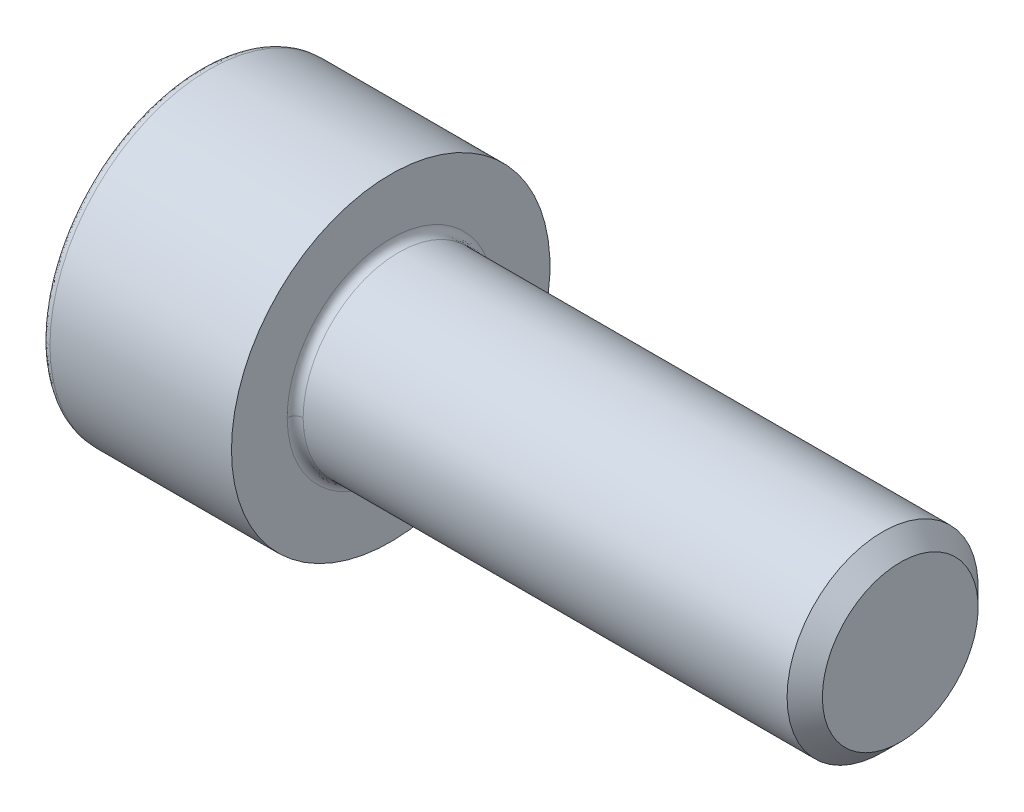
ISO-10303-21;
HEADER;
FILE_DESCRIPTION(('STEP AP214'),'2;1');
FILE_NAME('part.step','',(''),(''),'','','');
FILE_SCHEMA(('AUTOMOTIVE_DESIGN { 1 0 10303 214 1 1 1 1 }'));
ENDSEC;
DATA;
#1=APPLICATION_CONTEXT('core data for automotive mechanical design processes');
#2=APPLICATION_PROTOCOL_DEFINITION('international standard','automotive_design',2000,#1);
#3=PRODUCT_CONTEXT('',#1,'mechanical');
#4=PRODUCT('Part','Part','',(#3));
#5=PRODUCT_RELATED_PRODUCT_CATEGORY('part','',(#4));
#6=PRODUCT_DEFINITION_FORMATION('','',#4);
#7=PRODUCT_DEFINITION_CONTEXT('part definition',#1,'design');
#8=PRODUCT_DEFINITION('design','',#6,#7);
#9=PRODUCT_DEFINITION_SHAPE('','',#8);
#10=(LENGTH_UNIT() NAMED_UNIT(*) SI_UNIT(.MILLI.,.METRE.));
#11=(NAMED_UNIT(*) PLANE_ANGLE_UNIT() SI_UNIT($,.RADIAN.));
#12=(NAMED_UNIT(*) SI_UNIT($,.STERADIAN.) SOLID_ANGLE_UNIT());
#13=UNCERTAINTY_MEASURE_WITH_UNIT(LENGTH_MEASURE(1.E-05),#10,'distance_accuracy_value','');
#14=(GEOMETRIC_REPRESENTATION_CONTEXT(3) GLOBAL_UNCERTAINTY_ASSIGNED_CONTEXT((#13)) GLOBAL_UNIT_ASSIGNED_CONTEXT((#10,
#11,#12)) REPRESENTATION_CONTEXT('',''));
#15=CARTESIAN_POINT('',(0.,0.,0.));
#16=DIRECTION('',(0.,0.,1.));
#17=DIRECTION('',(1.,0.,0.));
#18=AXIS2_PLACEMENT_3D('',#15,#16,#17);
#19=CARTESIAN_POINT('',(22.,-2.474846,2.474846));
#20=DIRECTION('',(1.,0.,0.));
#21=DIRECTION('',(0.,0.,-1.));
#22=AXIS2_PLACEMENT_3D('',#19,#20,#21);
#23=PLANE('',#22);
#24=CARTESIAN_POINT('',(22.,0.,0.));
#25=DIRECTION('',(-1.,0.,0.));
#26=DIRECTION('',(0.,0.,1.));
#27=AXIS2_PLACEMENT_3D('',#24,#25,#26);
#28=CIRCLE('',#27,2.44549999999998);
#29=CARTESIAN_POINT('',(22.,0.,2.44549999999998));
#30=VERTEX_POINT('',#29);
#31=EDGE_CURVE('E21',#30,#30,#28,.F.);
#32=ORIENTED_EDGE('',*,*,#31,.T.);
#33=EDGE_LOOP('',(#32));
#34=FACE_BOUND('',#33,.T.);
#35=ADVANCED_FACE('F17',(#34),#23,.T.);
#36=CARTESIAN_POINT('',(22.,0.,0.));
#37=DIRECTION('',(-1.,0.,0.));
#38=DIRECTION('',(0.,0.,1.));
#39=AXIS2_PLACEMENT_3D('',#36,#37,#38);
#40=CONICAL_SURFACE('',#39,2.4455,0.785398163397446);
#41=CARTESIAN_POINT('',(21.4455,0.,0.));
#42=DIRECTION('',(-1.,0.,0.));
#43=DIRECTION('',(0.,0.,1.));
#44=AXIS2_PLACEMENT_3D('',#41,#42,#43);
#45=CIRCLE('',#44,3.);
#46=CARTESIAN_POINT('',(21.4455,0.,3.));
#47=VERTEX_POINT('',#46);
#48=EDGE_CURVE('E351',#47,#47,#45,.F.);
#49=ORIENTED_EDGE('',*,*,#48,.T.);
#50=EDGE_LOOP('',(#49));
#51=FACE_BOUND('',#50,.T.);
#52=ORIENTED_EDGE('',*,*,#31,.F.);
#53=EDGE_LOOP('',(#52));
#54=FACE_BOUND('',#53,.T.);
#55=ADVANCED_FACE('F440',(#51,#54),#40,.T.);
#56=CARTESIAN_POINT('',(21.4455,0.,0.));
#57=DIRECTION('',(-1.,0.,0.));
#58=DIRECTION('',(0.,0.,1.));
#59=AXIS2_PLACEMENT_3D('',#56,#57,#58);
#60=CYLINDRICAL_SURFACE('',#59,3.);
#61=CARTESIAN_POINT('',(6.24999999978248,0.,0.));
#62=DIRECTION('',(1.,0.,0.));
#63=DIRECTION('',(0.,0.,-1.));
#64=AXIS2_PLACEMENT_3D('',#61,#62,#63);
#65=CIRCLE('',#64,3.00000000023549);
#66=CARTESIAN_POINT('',(6.24999999978248,-3.07655142772997E-10,-3.00000000017662));
#67=VERTEX_POINT('',#66);
#68=CARTESIAN_POINT('',(6.24999999983686,0.,3.00000000017662));
#69=VERTEX_POINT('',#68);
#70=EDGE_CURVE('E354',#67,#69,#65,.T.);
#71=ORIENTED_EDGE('',*,*,#70,.T.);
#72=CARTESIAN_POINT('',(6.24999999978248,0.,0.));
#73=DIRECTION('',(1.,0.,0.));
#74=DIRECTION('',(0.,0.,-1.));
#75=AXIS2_PLACEMENT_3D('',#72,#73,#74);
#76=CIRCLE('',#75,3.00000000023549);
#77=EDGE_CURVE('E343',#69,#67,#76,.T.);
#78=ORIENTED_EDGE('',*,*,#77,.T.);
#79=EDGE_LOOP('',(#71,#78));
#80=FACE_BOUND('',#79,.T.);
#81=ORIENTED_EDGE('',*,*,#48,.F.);
#82=EDGE_LOOP('',(#81));
#83=FACE_BOUND('',#82,.T.);
#84=ADVANCED_FACE('F328',(#80,#83),#60,.T.);
#85=CARTESIAN_POINT('',(6.001248959,0.,3.274958354));
#86=CARTESIAN_POINT('',(6.001248959,-6.549916708,3.274958354));
#87=CARTESIAN_POINT('',(6.001248959,-6.549916708,-3.274958354));
#88=CARTESIAN_POINT('',(6.001248959,0.,-3.274958354));
#89=CARTESIAN_POINT('',(5.984194894,0.,3.104986559));
#90=CARTESIAN_POINT('',(5.984194894,-6.209973117,3.104986559));
#91=CARTESIAN_POINT('',(5.984194894,-6.209973117,-3.104986559));
#92=CARTESIAN_POINT('',(5.984194894,0.,-3.104986559));
#93=CARTESIAN_POINT('',(6.104986559,0.,2.984194894));
#94=CARTESIAN_POINT('',(6.104986559,-5.968389789,2.984194894));
#95=CARTESIAN_POINT('',(6.104986559,-5.968389789,-2.984194894));
#96=CARTESIAN_POINT('',(6.104986559,0.,-2.984194894));
#97=CARTESIAN_POINT('',(6.274958354,0.,3.001248959));
#98=CARTESIAN_POINT('',(6.274958354,-6.002497917,3.001248959));
#99=CARTESIAN_POINT('',(6.274958354,-6.002497917,-3.001248959));
#100=CARTESIAN_POINT('',(6.274958354,0.,-3.001248959));
#101=(BOUNDED_SURFACE() B_SPLINE_SURFACE(3,3,((#85,#86,#87,#88),(#89,#90,#91,#92),(#93,#94,#95,
#96),(#97,#98,#99,#100)),.UNSPECIFIED.,.F.,.F.,.F.) B_SPLINE_SURFACE_WITH_KNOTS((4,4),(4,4),(0.,
1.),(0.,1.),.UNSPECIFIED.) GEOMETRIC_REPRESENTATION_ITEM() RATIONAL_B_SPLINE_SURFACE(((1.,
0.333333333333333,0.333333333333333,1.),(0.755320871117972,0.251773623705991,0.251773623705991,
0.755320871117972),(0.755320871117972,0.251773623705991,0.251773623705991,0.755320871117972),
(1.,0.333333333333333,0.333333333333333,1.))) REPRESENTATION_ITEM('') SURFACE());
#102=CARTESIAN_POINT('',(6.001248959,0.,3.274958354));
#103=CARTESIAN_POINT('',(5.984194894,0.,3.104986559));
#104=CARTESIAN_POINT('',(6.104986559,0.,2.984194894));
#105=CARTESIAN_POINT('',(6.274958354,0.,3.001248959));
#106=(BOUNDED_CURVE() B_SPLINE_CURVE(3,(#102,#103,#104,#105),.UNSPECIFIED.,.F.,
.F.) B_SPLINE_CURVE_WITH_KNOTS((4,4),(0.,1.),
.UNSPECIFIED.) CURVE() GEOMETRIC_REPRESENTATION_ITEM() RATIONAL_B_SPLINE_CURVE((1.,
0.755320871117972,0.755320871117972,1.)) REPRESENTATION_ITEM(''));
#107=CARTESIAN_POINT('',(6.00000000014129,0.,3.24999999964183));
#108=VERTEX_POINT('',#107);
#109=EDGE_CURVE('E303',#69,#108,#106,.F.);
#110=CARTESIAN_POINT('',(6.00000000023549,0.,3.24999999981333));
#111=CARTESIAN_POINT('',(6.00000000023549,-6.49999999950396,3.24999999981333));
#112=CARTESIAN_POINT('',(6.00000000023549,-6.49999999950396,-3.24999999981333));
#113=CARTESIAN_POINT('',(6.00000000023549,0.,-3.24999999981333));
#114=(BOUNDED_CURVE() B_SPLINE_CURVE(3,(#110,#111,#112,#113),.UNSPECIFIED.,.F.,
.F.) B_SPLINE_CURVE_WITH_KNOTS((4,4),(0.,1.),
.UNSPECIFIED.) CURVE() GEOMETRIC_REPRESENTATION_ITEM() RATIONAL_B_SPLINE_CURVE((0.95657830221489,
0.31885943407163,0.31885943407163,0.95657830221489)) REPRESENTATION_ITEM(''));
#115=CARTESIAN_POINT('',(6.00000000014129,0.,-3.24999999964183));
#116=VERTEX_POINT('',#115);
#117=EDGE_CURVE('E363',#116,#108,#114,.F.);
#118=CARTESIAN_POINT('',(6.001248959,0.,-3.274958354));
#119=CARTESIAN_POINT('',(5.984194894,0.,-3.104986559));
#120=CARTESIAN_POINT('',(6.104986559,0.,-2.984194894));
#121=CARTESIAN_POINT('',(6.274958354,0.,-3.001248959));
#122=(BOUNDED_CURVE() B_SPLINE_CURVE(3,(#118,#119,#120,#121),.UNSPECIFIED.,.F.,
.F.) B_SPLINE_CURVE_WITH_KNOTS((4,4),(0.,1.),
.UNSPECIFIED.) CURVE() GEOMETRIC_REPRESENTATION_ITEM() RATIONAL_B_SPLINE_CURVE((1.,
0.755320871117972,0.755320871117972,1.)) REPRESENTATION_ITEM(''));
#123=EDGE_CURVE('E350',#116,#67,#122,.T.);
#124=ORIENTED_EDGE('',*,*,#109,.T.);
#125=ORIENTED_EDGE('',*,*,#117,.F.);
#126=ORIENTED_EDGE('',*,*,#123,.T.);
#127=ORIENTED_EDGE('',*,*,#77,.F.);
#128=EDGE_LOOP('',(#124,#125,#126,#127));
#129=FACE_BOUND('',#128,.T.);
#130=ADVANCED_FACE('F317',(#129),#101,.F.);
#131=CARTESIAN_POINT('',(6.001248959,0.,-3.274958354));
#132=CARTESIAN_POINT('',(6.001248959,6.549916708,-3.274958354));
#133=CARTESIAN_POINT('',(6.001248959,6.549916708,3.274958354));
#134=CARTESIAN_POINT('',(6.001248959,0.,3.274958354));
#135=CARTESIAN_POINT('',(5.984194894,0.,-3.104986559));
#136=CARTESIAN_POINT('',(5.984194894,6.209973117,-3.104986559));
#137=CARTESIAN_POINT('',(5.984194894,6.209973117,3.104986559));
#138=CARTESIAN_POINT('',(5.984194894,0.,3.104986559));
#139=CARTESIAN_POINT('',(6.104986559,0.,-2.984194894));
#140=CARTESIAN_POINT('',(6.104986559,5.968389789,-2.984194894));
#141=CARTESIAN_POINT('',(6.104986559,5.968389789,2.984194894));
#142=CARTESIAN_POINT('',(6.104986559,0.,2.984194894));
#143=CARTESIAN_POINT('',(6.274958354,0.,-3.001248959));
#144=CARTESIAN_POINT('',(6.274958354,6.002497917,-3.001248959));
#145=CARTESIAN_POINT('',(6.274958354,6.002497917,3.001248959));
#146=CARTESIAN_POINT('',(6.274958354,0.,3.001248959));
#147=(BOUNDED_SURFACE() B_SPLINE_SURFACE(3,3,((#131,#132,#133,#134),(#135,#136,#137,#138),(#139,
#140,#141,#142),(#143,#144,#145,#146)),.UNSPECIFIED.,.F.,.F.,
.F.) B_SPLINE_SURFACE_WITH_KNOTS((4,4),(4,4),(0.,1.),(0.,1.),
.UNSPECIFIED.) GEOMETRIC_REPRESENTATION_ITEM() RATIONAL_B_SPLINE_SURFACE(((1.,0.333333333333333,
0.333333333333333,1.),(0.755320871117972,0.251773623705991,0.251773623705991,0.755320871117972),
(0.755320871117972,0.251773623705991,0.251773623705991,0.755320871117972),(1.,0.333333333333333,
0.333333333333333,1.))) REPRESENTATION_ITEM('') SURFACE());
#148=CARTESIAN_POINT('',(6.00000000023549,0.,-3.24999999981333));
#149=CARTESIAN_POINT('',(6.00000000023549,6.49999999950396,-3.24999999981333));
#150=CARTESIAN_POINT('',(6.00000000023549,6.49999999950396,3.24999999981333));
#151=CARTESIAN_POINT('',(6.00000000023549,0.,3.24999999981333));
#152=(BOUNDED_CURVE() B_SPLINE_CURVE(3,(#148,#149,#150,#151),.UNSPECIFIED.,.F.,
.F.) B_SPLINE_CURVE_WITH_KNOTS((4,4),(0.,1.),
.UNSPECIFIED.) CURVE() GEOMETRIC_REPRESENTATION_ITEM() RATIONAL_B_SPLINE_CURVE((0.956578302214891,
0.31885943407163,0.31885943407163,0.956578302214891)) REPRESENTATION_ITEM(''));
#153=EDGE_CURVE('E299',#108,#116,#152,.F.);
#154=ORIENTED_EDGE('',*,*,#70,.F.);
#155=ORIENTED_EDGE('',*,*,#123,.F.);
#156=ORIENTED_EDGE('',*,*,#153,.F.);
#157=ORIENTED_EDGE('',*,*,#109,.F.);
#158=EDGE_LOOP('',(#154,#155,#156,#157));
#159=FACE_BOUND('',#158,.T.);
#160=ADVANCED_FACE('F305',(#159),#147,.F.);
#161=CARTESIAN_POINT('',(6.,-5.06,5.06));
#162=DIRECTION('',(1.,0.,0.));
#163=DIRECTION('',(0.,0.,-1.));
#164=AXIS2_PLACEMENT_3D('',#161,#162,#163);
#165=PLANE('',#164);
#166=ORIENTED_EDGE('',*,*,#117,.T.);
#167=ORIENTED_EDGE('',*,*,#153,.T.);
#168=EDGE_LOOP('',(#166,#167));
#169=FACE_BOUND('',#168,.T.);
#170=CARTESIAN_POINT('',(6.,0.,0.));
#171=DIRECTION('',(-1.,0.,0.));
#172=DIRECTION('',(0.,0.,1.));
#173=AXIS2_PLACEMENT_3D('',#170,#171,#172);
#174=CIRCLE('',#173,5.);
#175=CARTESIAN_POINT('',(6.,0.,5.));
#176=VERTEX_POINT('',#175);
#177=EDGE_CURVE('E287',#176,#176,#174,.F.);
#178=ORIENTED_EDGE('',*,*,#177,.T.);
#179=EDGE_LOOP('',(#178));
#180=FACE_BOUND('',#179,.T.);
#181=ADVANCED_FACE('F316',(#169,#180),#165,.T.);
#182=CARTESIAN_POINT('',(6.,0.,0.));
#183=DIRECTION('',(-1.,0.,0.));
#184=DIRECTION('',(0.,0.,1.));
#185=AXIS2_PLACEMENT_3D('',#182,#183,#184);
#186=CYLINDRICAL_SURFACE('',#185,5.);
#187=ORIENTED_EDGE('',*,*,#177,.F.);
#188=EDGE_LOOP('',(#187));
#189=FACE_BOUND('',#188,.T.);
#190=CARTESIAN_POINT('',(0.29999999980743,0.,0.));
#191=DIRECTION('',(-1.,0.,0.));
#192=DIRECTION('',(0.,-1.,0.));
#193=AXIS2_PLACEMENT_3D('',#190,#191,#192);
#194=CIRCLE('',#193,5.00000000038587);
#195=CARTESIAN_POINT('',(0.299999999855573,-2.24484071071833E-10,5.0000000002894));
#196=VERTEX_POINT('',#195);
#197=CARTESIAN_POINT('',(0.29999999980743,-5.12758571288328E-10,-5.0000000002894));
#198=VERTEX_POINT('',#197);
#199=EDGE_CURVE('E284',#196,#198,#194,.T.);
#200=ORIENTED_EDGE('',*,*,#199,.F.);
#201=CARTESIAN_POINT('',(0.29999999980743,0.,0.));
#202=DIRECTION('',(-1.,0.,0.));
#203=DIRECTION('',(0.,-1.,0.));
#204=AXIS2_PLACEMENT_3D('',#201,#202,#203);
#205=CIRCLE('',#204,5.00000000038587);
#206=EDGE_CURVE('E290',#198,#196,#205,.T.);
#207=ORIENTED_EDGE('',*,*,#206,.F.);
#208=EDGE_LOOP('',(#200,#207));
#209=FACE_BOUND('',#208,.T.);
#210=ADVANCED_FACE('F231',(#189,#209),#186,.T.);
#211=CARTESIAN_POINT('',(0.00149875,0.,4.670049975));
#212=CARTESIAN_POINT('',(0.00149875,9.34009995,4.670049975));
#213=CARTESIAN_POINT('',(0.00149875,9.34009995,-4.670049975));
#214=CARTESIAN_POINT('',(0.00149875,0.,-4.670049975));
#215=CARTESIAN_POINT('',(-0.018966127,0.,4.87401613));
#216=CARTESIAN_POINT('',(-0.018966127,9.748032259,4.87401613));
#217=CARTESIAN_POINT('',(-0.018966127,9.748032259,-4.87401613));
#218=CARTESIAN_POINT('',(-0.018966127,0.,-4.87401613));
#219=CARTESIAN_POINT('',(0.12598387,0.,5.018966127));
#220=CARTESIAN_POINT('',(0.12598387,10.037932254,5.018966127));
#221=CARTESIAN_POINT('',(0.12598387,10.037932254,-5.018966127));
#222=CARTESIAN_POINT('',(0.12598387,0.,-5.018966127));
#223=CARTESIAN_POINT('',(0.329950025,0.,4.99850125));
#224=CARTESIAN_POINT('',(0.329950025,9.997002499,4.99850125));
#225=CARTESIAN_POINT('',(0.329950025,9.997002499,-4.99850125));
#226=CARTESIAN_POINT('',(0.329950025,0.,-4.99850125));
#227=(BOUNDED_SURFACE() B_SPLINE_SURFACE(3,3,((#211,#212,#213,#214),(#215,#216,#217,#218),(#219,
#220,#221,#222),(#223,#224,#225,#226)),.UNSPECIFIED.,.F.,.F.,
.F.) B_SPLINE_SURFACE_WITH_KNOTS((4,4),(4,4),(0.,1.),(0.,1.),
.UNSPECIFIED.) GEOMETRIC_REPRESENTATION_ITEM() RATIONAL_B_SPLINE_SURFACE(((1.,0.333333333333333,
0.333333333333333,1.),(0.755320871117972,0.251773623705991,0.251773623705991,0.755320871117972),
(0.755320871117972,0.251773623705991,0.251773623705991,0.755320871117972),(1.,0.333333333333333,
0.333333333333333,1.))) REPRESENTATION_ITEM('') SURFACE());
#228=CARTESIAN_POINT('',(-3.85867261707578E-10,0.,-4.70000000022572));
#229=CARTESIAN_POINT('',(-3.85867264776779E-10,9.4000000003199,-4.70000000022572));
#230=CARTESIAN_POINT('',(-3.85867264776779E-10,9.4000000003199,4.70000000022572));
#231=CARTESIAN_POINT('',(-3.85867261707578E-10,0.,4.70000000022572));
#232=(BOUNDED_CURVE() B_SPLINE_CURVE(3,(#228,#229,#230,#231),.UNSPECIFIED.,.F.,
.F.) B_SPLINE_CURVE_WITH_KNOTS((4,4),(0.,1.),
.UNSPECIFIED.) CURVE() GEOMETRIC_REPRESENTATION_ITEM() RATIONAL_B_SPLINE_CURVE((0.95657830212221,
0.318859434040737,0.318859434040737,0.95657830212221)) REPRESENTATION_ITEM(''));
#233=CARTESIAN_POINT('',(-2.3152035707117E-10,0.,4.69999999919632));
#234=VERTEX_POINT('',#233);
#235=CARTESIAN_POINT('',(-2.3152035707117E-10,0.,-4.69999999919632));
#236=VERTEX_POINT('',#235);
#237=EDGE_CURVE('E86',#234,#236,#232,.F.);
#238=CARTESIAN_POINT('',(0.00149875,0.,4.670049975));
#239=CARTESIAN_POINT('',(-0.018966127,0.,4.87401613));
#240=CARTESIAN_POINT('',(0.12598387,0.,5.018966127));
#241=CARTESIAN_POINT('',(0.329950025,0.,4.99850125));
#242=(BOUNDED_CURVE() B_SPLINE_CURVE(3,(#238,#239,#240,#241),.UNSPECIFIED.,.F.,
.F.) B_SPLINE_CURVE_WITH_KNOTS((4,4),(0.,1.),
.UNSPECIFIED.) CURVE() GEOMETRIC_REPRESENTATION_ITEM() RATIONAL_B_SPLINE_CURVE((1.,
0.755320871117972,0.755320871117972,1.)) REPRESENTATION_ITEM(''));
#243=EDGE_CURVE('E204',#196,#234,#242,.F.);
#244=CARTESIAN_POINT('',(0.00149875,0.,-4.670049975));
#245=CARTESIAN_POINT('',(-0.018966127,0.,-4.87401613));
#246=CARTESIAN_POINT('',(0.12598387,0.,-5.018966127));
#247=CARTESIAN_POINT('',(0.329950025,0.,-4.99850125));
#248=(BOUNDED_CURVE() B_SPLINE_CURVE(3,(#244,#245,#246,#247),.UNSPECIFIED.,.F.,
.F.) B_SPLINE_CURVE_WITH_KNOTS((4,4),(0.,1.),
.UNSPECIFIED.) CURVE() GEOMETRIC_REPRESENTATION_ITEM() RATIONAL_B_SPLINE_CURVE((1.,
0.755320871117972,0.755320871117972,1.)) REPRESENTATION_ITEM(''));
#249=EDGE_CURVE('E286',#236,#198,#248,.T.);
#250=ORIENTED_EDGE('',*,*,#237,.F.);
#251=ORIENTED_EDGE('',*,*,#243,.F.);
#252=ORIENTED_EDGE('',*,*,#199,.T.);
#253=ORIENTED_EDGE('',*,*,#249,.F.);
#254=EDGE_LOOP('',(#250,#251,#252,#253));
#255=FACE_BOUND('',#254,.T.);
#256=ADVANCED_FACE('F219',(#255),#227,.T.);
#257=CARTESIAN_POINT('',(0.00149875,0.,-4.670049975));
#258=CARTESIAN_POINT('',(0.00149875,-9.34009995,-4.670049975));
#259=CARTESIAN_POINT('',(0.00149875,-9.34009995,4.670049975));
#260=CARTESIAN_POINT('',(0.00149875,0.,4.670049975));
#261=CARTESIAN_POINT('',(-0.018966127,0.,-4.87401613));
#262=CARTESIAN_POINT('',(-0.018966127,-9.748032259,-4.87401613));
#263=CARTESIAN_POINT('',(-0.018966127,-9.748032259,4.87401613));
#264=CARTESIAN_POINT('',(-0.018966127,0.,4.87401613));
#265=CARTESIAN_POINT('',(0.12598387,0.,-5.018966127));
#266=CARTESIAN_POINT('',(0.12598387,-10.037932254,-5.018966127));
#267=CARTESIAN_POINT('',(0.12598387,-10.037932254,5.018966127));
#268=CARTESIAN_POINT('',(0.12598387,0.,5.018966127));
#269=CARTESIAN_POINT('',(0.329950025,0.,-4.99850125));
#270=CARTESIAN_POINT('',(0.329950025,-9.997002499,-4.99850125));
#271=CARTESIAN_POINT('',(0.329950025,-9.997002499,4.99850125));
#272=CARTESIAN_POINT('',(0.329950025,0.,4.99850125));
#273=(BOUNDED_SURFACE() B_SPLINE_SURFACE(3,3,((#257,#258,#259,#260),(#261,#262,#263,#264),(#265,
#266,#267,#268),(#269,#270,#271,#272)),.UNSPECIFIED.,.F.,.F.,
.F.) B_SPLINE_SURFACE_WITH_KNOTS((4,4),(4,4),(0.,1.),(0.,1.),
.UNSPECIFIED.) GEOMETRIC_REPRESENTATION_ITEM() RATIONAL_B_SPLINE_SURFACE(((1.,0.333333333333333,
0.333333333333333,1.),(0.755320871117972,0.251773623705991,0.251773623705991,0.755320871117972),
(0.755320871117972,0.251773623705991,0.251773623705991,0.755320871117972),(1.,0.333333333333333,
0.333333333333333,1.))) REPRESENTATION_ITEM('') SURFACE());
#274=CARTESIAN_POINT('',(-3.85867261925231E-10,0.,4.70000000022572));
#275=CARTESIAN_POINT('',(-3.85867264679281E-10,-9.4000000003199,4.70000000022572));
#276=CARTESIAN_POINT('',(-3.85867264679281E-10,-9.4000000003199,-4.70000000022572));
#277=CARTESIAN_POINT('',(-3.85867261925231E-10,0.,-4.70000000022572));
#278=(BOUNDED_CURVE() B_SPLINE_CURVE(3,(#274,#275,#276,#277),.UNSPECIFIED.,.F.,
.F.) B_SPLINE_CURVE_WITH_KNOTS((4,4),(0.,1.),
.UNSPECIFIED.) CURVE() GEOMETRIC_REPRESENTATION_ITEM() RATIONAL_B_SPLINE_CURVE((0.95657830212221,
0.318859434040737,0.318859434040737,0.95657830212221)) REPRESENTATION_ITEM(''));
#279=EDGE_CURVE('E199',#236,#234,#278,.F.);
#280=ORIENTED_EDGE('',*,*,#243,.T.);
#281=ORIENTED_EDGE('',*,*,#279,.F.);
#282=ORIENTED_EDGE('',*,*,#249,.T.);
#283=ORIENTED_EDGE('',*,*,#206,.T.);
#284=EDGE_LOOP('',(#280,#281,#282,#283));
#285=FACE_BOUND('',#284,.T.);
#286=ADVANCED_FACE('F206',(#285),#273,.T.);
#287=CARTESIAN_POINT('',(0.,1.467624384,2.542));
#288=DIRECTION('',(0.,-0.866025403678227,-0.500000000183963));
#289=DIRECTION('',(0.,0.500000000183963,-0.866025403678227));
#290=AXIS2_PLACEMENT_3D('',#287,#288,#289);
#291=PLANE('',#290);
#292=DIRECTION('',(0.,-0.500000000183963,0.866025403678227));
#293=VECTOR('',#292,1.);
#294=CARTESIAN_POINT('',(3.,2.2014365765,1.271));
#295=LINE('',#294,#293);
#296=CARTESIAN_POINT('',(3.,2.20143657635501,1.27100000025113));
#297=VERTEX_POINT('',#296);
#298=CARTESIAN_POINT('',(3.,1.467624384,2.542));
#299=VERTEX_POINT('',#298);
#300=EDGE_CURVE('E265',#297,#299,#295,.T.);
#301=ORIENTED_EDGE('',*,*,#300,.T.);
#302=DIRECTION('',(-1.,0.,0.));
#303=VECTOR('',#302,1.);
#304=CARTESIAN_POINT('',(1.5,1.467624384,2.542));
#305=LINE('',#304,#303);
#306=CARTESIAN_POINT('',(0.,1.4676243852548,2.541999999613));
#307=VERTEX_POINT('',#306);
#308=EDGE_CURVE('E184',#299,#307,#305,.T.);
#309=ORIENTED_EDGE('',*,*,#308,.T.);
#310=DIRECTION('',(0.,-0.50000000064581,0.86602540341158));
#311=VECTOR('',#310,1.);
#312=CARTESIAN_POINT('',(0.,2.9352487730192,0.));
#313=LINE('',#312,#311);
#314=CARTESIAN_POINT('',(0.,2.9352487717632,-4.35091117865008E-10));
#315=VERTEX_POINT('',#314);
#316=EDGE_CURVE('E194',#315,#307,#313,.T.);
#317=ORIENTED_EDGE('',*,*,#316,.F.);
#318=DIRECTION('',(1.,0.,0.));
#319=VECTOR('',#318,1.);
#320=CARTESIAN_POINT('',(1.5,2.935248769,0.));
#321=LINE('',#320,#319);
#322=CARTESIAN_POINT('',(3.,2.935248769,0.));
#323=VERTEX_POINT('',#322);
#324=EDGE_CURVE('E77',#315,#323,#321,.T.);
#325=ORIENTED_EDGE('',*,*,#324,.T.);
#326=DIRECTION('',(0.,-0.500000000183963,0.866025403678227));
#327=VECTOR('',#326,1.);
#328=CARTESIAN_POINT('',(3.,2.2014365765,1.271));
#329=LINE('',#328,#327);
#330=EDGE_CURVE('E263',#323,#297,#329,.T.);
#331=ORIENTED_EDGE('',*,*,#330,.T.);
#332=EDGE_LOOP('',(#301,#309,#317,#325,#331));
#333=FACE_BOUND('',#332,.T.);
#334=ADVANCED_FACE('F218',(#333),#291,.T.);
#335=CARTESIAN_POINT('',(0.,1.467624384,2.542));
#336=DIRECTION('',(0.,0.,1.));
#337=DIRECTION('',(0.,-1.,0.));
#338=AXIS2_PLACEMENT_3D('',#335,#336,#337);
#339=PLANE('',#338);
#340=ORIENTED_EDGE('',*,*,#308,.F.);
#341=DIRECTION('',(0.,1.,0.));
#342=VECTOR('',#341,1.);
#343=CARTESIAN_POINT('',(3.,0.,2.542));
#344=LINE('',#343,#342);
#345=CARTESIAN_POINT('',(3.,-2.28255403465839E-10,2.542));
#346=VERTEX_POINT('',#345);
#347=EDGE_CURVE('E188',#346,#299,#344,.T.);
#348=ORIENTED_EDGE('',*,*,#347,.F.);
#349=DIRECTION('',(0.,1.,0.));
#350=VECTOR('',#349,1.);
#351=CARTESIAN_POINT('',(3.,0.,2.542));
#352=LINE('',#351,#350);
#353=CARTESIAN_POINT('',(3.,-1.467624384,2.542));
#354=VERTEX_POINT('',#353);
#355=EDGE_CURVE('E124',#354,#346,#352,.T.);
#356=ORIENTED_EDGE('',*,*,#355,.F.);
#357=DIRECTION('',(1.,0.,0.));
#358=VECTOR('',#357,1.);
#359=CARTESIAN_POINT('',(1.5,-1.467624384,2.542));
#360=LINE('',#359,#358);
#361=CARTESIAN_POINT('',(0.,-1.4676243852548,2.541999999613));
#362=VERTEX_POINT('',#361);
#363=EDGE_CURVE('E187',#362,#354,#360,.T.);
#364=ORIENTED_EDGE('',*,*,#363,.F.);
#365=DIRECTION('',(0.,-1.,0.));
#366=VECTOR('',#365,1.);
#367=CARTESIAN_POINT('',(0.,0.,2.541999999484));
#368=LINE('',#367,#366);
#369=EDGE_CURVE('E191',#307,#362,#368,.T.);
#370=ORIENTED_EDGE('',*,*,#369,.F.);
#371=EDGE_LOOP('',(#340,#348,#356,#364,#370));
#372=FACE_BOUND('',#371,.T.);
#373=ADVANCED_FACE('F468',(#372),#339,.F.);
#374=CARTESIAN_POINT('',(0.,-2.935248769,0.));
#375=DIRECTION('',(0.,0.866025403678227,-0.500000000183963));
#376=DIRECTION('',(0.,0.500000000183963,0.866025403678227));
#377=AXIS2_PLACEMENT_3D('',#374,#375,#376);
#378=PLANE('',#377);
#379=DIRECTION('',(0.,-0.500000000183963,-0.866025403678227));
#380=VECTOR('',#379,1.);
#381=CARTESIAN_POINT('',(3.,-2.2014365765,1.271));
#382=LINE('',#381,#380);
#383=CARTESIAN_POINT('',(3.,-2.20143657635501,1.27100000025113));
#384=VERTEX_POINT('',#383);
#385=CARTESIAN_POINT('',(3.,-2.935248769,0.));
#386=VERTEX_POINT('',#385);
#387=EDGE_CURVE('E181',#384,#386,#382,.T.);
#388=ORIENTED_EDGE('',*,*,#387,.T.);
#389=DIRECTION('',(1.,0.,0.));
#390=VECTOR('',#389,1.);
#391=CARTESIAN_POINT('',(1.5,-2.935248769,0.));
#392=LINE('',#391,#390);
#393=CARTESIAN_POINT('',(0.,-2.9352487717632,4.35090866656742E-10));
#394=VERTEX_POINT('',#393);
#395=EDGE_CURVE('E174',#394,#386,#392,.T.);
#396=ORIENTED_EDGE('',*,*,#395,.F.);
#397=DIRECTION('',(0.,-0.50000000064581,-0.86602540341158));
#398=VECTOR('',#397,1.);
#399=CARTESIAN_POINT('',(0.,-1.4676243865096,2.541999999484));
#400=LINE('',#399,#398);
#401=EDGE_CURVE('E193',#362,#394,#400,.T.);
#402=ORIENTED_EDGE('',*,*,#401,.F.);
#403=ORIENTED_EDGE('',*,*,#363,.T.);
#404=DIRECTION('',(0.,-0.500000000183963,-0.866025403678227));
#405=VECTOR('',#404,1.);
#406=CARTESIAN_POINT('',(3.,-2.2014365765,1.271));
#407=LINE('',#406,#405);
#408=EDGE_CURVE('E116',#354,#384,#407,.T.);
#409=ORIENTED_EDGE('',*,*,#408,.T.);
#410=EDGE_LOOP('',(#388,#396,#402,#403,#409));
#411=FACE_BOUND('',#410,.T.);
#412=ADVANCED_FACE('F464',(#411),#378,.T.);
#413=CARTESIAN_POINT('',(0.,1.467624384,-2.542));
#414=DIRECTION('',(0.,0.866025403678227,-0.500000000183963));
#415=DIRECTION('',(0.,0.500000000183963,0.866025403678227));
#416=AXIS2_PLACEMENT_3D('',#413,#414,#415);
#417=PLANE('',#416);
#418=DIRECTION('',(1.,0.,0.));
#419=VECTOR('',#418,1.);
#420=CARTESIAN_POINT('',(1.5,1.467624384,-2.542));
#421=LINE('',#420,#419);
#422=CARTESIAN_POINT('',(0.,1.46762438510584,-2.542));
#423=VERTEX_POINT('',#422);
#424=CARTESIAN_POINT('',(3.,1.46762438411084,-2.542));
#425=VERTEX_POINT('',#424);
#426=EDGE_CURVE('E155',#423,#425,#421,.T.);
#427=ORIENTED_EDGE('',*,*,#426,.T.);
#428=DIRECTION('',(0.,-0.500000000183963,-0.866025403678227));
#429=VECTOR('',#428,1.);
#430=CARTESIAN_POINT('',(3.,2.2014365765,-1.271));
#431=LINE('',#430,#429);
#432=CARTESIAN_POINT('',(3.,2.20143657656491,-1.27099999981833));
#433=VERTEX_POINT('',#432);
#434=EDGE_CURVE('E172',#433,#425,#431,.T.);
#435=ORIENTED_EDGE('',*,*,#434,.F.);
#436=DIRECTION('',(0.,-0.500000000183963,-0.866025403678227));
#437=VECTOR('',#436,1.);
#438=CARTESIAN_POINT('',(3.,2.2014365765,-1.271));
#439=LINE('',#438,#437);
#440=EDGE_CURVE('E175',#323,#433,#439,.T.);
#441=ORIENTED_EDGE('',*,*,#440,.F.);
#442=ORIENTED_EDGE('',*,*,#324,.F.);
#443=DIRECTION('',(0.,0.50000000064581,0.86602540341158));
#444=VECTOR('',#443,1.);
#445=CARTESIAN_POINT('',(0.,1.4676243865096,-2.541999999484));
#446=LINE('',#445,#444);
#447=EDGE_CURVE('E158',#423,#315,#446,.T.);
#448=ORIENTED_EDGE('',*,*,#447,.F.);
#449=EDGE_LOOP('',(#427,#435,#441,#442,#448));
#450=FACE_BOUND('',#449,.T.);
#451=ADVANCED_FACE('F478',(#450),#417,.F.);
#452=CARTESIAN_POINT('',(0.,-1.467624384,-2.542));
#453=DIRECTION('',(0.,0.866025403678227,0.500000000183963));
#454=DIRECTION('',(0.,-0.500000000183963,0.866025403678227));
#455=AXIS2_PLACEMENT_3D('',#452,#453,#454);
#456=PLANE('',#455);
#457=DIRECTION('',(0.,0.500000000183963,-0.866025403678227));
#458=VECTOR('',#457,1.);
#459=CARTESIAN_POINT('',(3.,-2.2014365765,-1.271));
#460=LINE('',#459,#458);
#461=CARTESIAN_POINT('',(3.,-2.20143657645078,-1.27100000001601));
#462=VERTEX_POINT('',#461);
#463=CARTESIAN_POINT('',(3.,-1.46762438401385,-2.541999999976));
#464=VERTEX_POINT('',#463);
#465=EDGE_CURVE('E136',#462,#464,#460,.T.);
#466=ORIENTED_EDGE('',*,*,#465,.T.);
#467=DIRECTION('',(-1.,0.,0.));
#468=VECTOR('',#467,1.);
#469=CARTESIAN_POINT('',(1.5,-1.467624384,-2.542));
#470=LINE('',#469,#468);
#471=CARTESIAN_POINT('',(0.,-1.46762438510584,-2.542));
#472=VERTEX_POINT('',#471);
#473=EDGE_CURVE('E139',#464,#472,#470,.T.);
#474=ORIENTED_EDGE('',*,*,#473,.T.);
#475=DIRECTION('',(0.,0.50000000064581,-0.86602540341158));
#476=VECTOR('',#475,1.);
#477=CARTESIAN_POINT('',(0.,-2.9352487730192,0.));
#478=LINE('',#477,#476);
#479=EDGE_CURVE('E429',#394,#472,#478,.T.);
#480=ORIENTED_EDGE('',*,*,#479,.F.);
#481=ORIENTED_EDGE('',*,*,#395,.T.);
#482=DIRECTION('',(0.,0.500000000183963,-0.866025403678227));
#483=VECTOR('',#482,1.);
#484=CARTESIAN_POINT('',(3.,-2.2014365765,-1.271));
#485=LINE('',#484,#483);
#486=EDGE_CURVE('E142',#386,#462,#485,.T.);
#487=ORIENTED_EDGE('',*,*,#486,.T.);
#488=EDGE_LOOP('',(#466,#474,#480,#481,#487));
#489=FACE_BOUND('',#488,.T.);
#490=ADVANCED_FACE('F137',(#489),#456,.T.);
#491=CARTESIAN_POINT('',(0.,-4.7564,-4.7564));
#492=DIRECTION('',(-1.,0.,0.));
#493=DIRECTION('',(0.,0.,1.));
#494=AXIS2_PLACEMENT_3D('',#491,#492,#493);
#495=PLANE('',#494);
#496=DIRECTION('',(0.,1.,0.));
#497=VECTOR('',#496,1.);
#498=CARTESIAN_POINT('',(0.,0.,-2.542));
#499=LINE('',#498,#497);
#500=EDGE_CURVE('E150',#472,#423,#499,.T.);
#501=ORIENTED_EDGE('',*,*,#500,.T.);
#502=ORIENTED_EDGE('',*,*,#447,.T.);
#503=ORIENTED_EDGE('',*,*,#316,.T.);
#504=ORIENTED_EDGE('',*,*,#369,.T.);
#505=ORIENTED_EDGE('',*,*,#401,.T.);
#506=ORIENTED_EDGE('',*,*,#479,.T.);
#507=EDGE_LOOP('',(#501,#502,#503,#504,#505,#506));
#508=FACE_BOUND('',#507,.T.);
#509=ORIENTED_EDGE('',*,*,#237,.T.);
#510=ORIENTED_EDGE('',*,*,#279,.T.);
#511=EDGE_LOOP('',(#509,#510));
#512=FACE_BOUND('',#511,.T.);
#513=ADVANCED_FACE('F394',(#508,#512),#495,.T.);
#514=CARTESIAN_POINT('',(0.,-1.467624384,-2.542));
#515=DIRECTION('',(0.,0.,-1.));
#516=DIRECTION('',(0.,1.,0.));
#517=AXIS2_PLACEMENT_3D('',#514,#515,#516);
#518=PLANE('',#517);
#519=ORIENTED_EDGE('',*,*,#473,.F.);
#520=DIRECTION('',(0.,-1.,0.));
#521=VECTOR('',#520,1.);
#522=CARTESIAN_POINT('',(3.,0.,-2.542));
#523=LINE('',#522,#521);
#524=CARTESIAN_POINT('',(3.,-5.21372915285972E-10,-2.542));
#525=VERTEX_POINT('',#524);
#526=EDGE_CURVE('E36',#525,#464,#523,.T.);
#527=ORIENTED_EDGE('',*,*,#526,.F.);
#528=DIRECTION('',(0.,-1.,0.));
#529=VECTOR('',#528,1.);
#530=CARTESIAN_POINT('',(3.,1.1007182885,-2.542));
#531=LINE('',#530,#529);
#532=EDGE_CURVE('E179',#425,#525,#531,.T.);
#533=ORIENTED_EDGE('',*,*,#532,.F.);
#534=ORIENTED_EDGE('',*,*,#426,.F.);
#535=ORIENTED_EDGE('',*,*,#500,.F.);
#536=EDGE_LOOP('',(#519,#527,#533,#534,#535));
#537=FACE_BOUND('',#536,.T.);
#538=ADVANCED_FACE('F148',(#537),#518,.F.);
#539=CARTESIAN_POINT('',(3.,-0.013208619,1.263374));
#540=DIRECTION('',(-1.,0.,0.));
#541=DIRECTION('',(0.,0.,1.));
#542=AXIS2_PLACEMENT_3D('',#539,#540,#541);
#543=PLANE('',#542);
#544=ORIENTED_EDGE('',*,*,#347,.T.);
#545=ORIENTED_EDGE('',*,*,#300,.F.);
#546=CARTESIAN_POINT('',(3.,0.,0.));
#547=DIRECTION('',(-1.,0.,0.));
#548=DIRECTION('',(0.,0.,1.));
#549=AXIS2_PLACEMENT_3D('',#546,#547,#548);
#550=CIRCLE('',#549,2.542);
#551=EDGE_CURVE('E425',#346,#297,#550,.T.);
#552=ORIENTED_EDGE('',*,*,#551,.F.);
#553=EDGE_LOOP('',(#544,#545,#552));
#554=FACE_BOUND('',#553,.T.);
#555=ADVANCED_FACE('F473',(#554),#543,.T.);
#556=CARTESIAN_POINT('',(3.,2.197033703,-1.286252));
#557=DIRECTION('',(-1.,0.,0.));
#558=DIRECTION('',(0.,0.,1.));
#559=AXIS2_PLACEMENT_3D('',#556,#557,#558);
#560=PLANE('',#559);
#561=ORIENTED_EDGE('',*,*,#330,.F.);
#562=ORIENTED_EDGE('',*,*,#440,.T.);
#563=CARTESIAN_POINT('',(3.,0.,0.));
#564=DIRECTION('',(-1.,0.,0.));
#565=DIRECTION('',(0.,0.,1.));
#566=AXIS2_PLACEMENT_3D('',#563,#564,#565);
#567=CIRCLE('',#566,2.542);
#568=EDGE_CURVE('E422',#297,#433,#567,.T.);
#569=ORIENTED_EDGE('',*,*,#568,.F.);
#570=EDGE_LOOP('',(#561,#562,#569));
#571=FACE_BOUND('',#570,.T.);
#572=ADVANCED_FACE('F477',(#571),#560,.T.);
#573=CARTESIAN_POINT('',(3.,-0.013208619,-2.542));
#574=DIRECTION('',(-1.,0.,0.));
#575=DIRECTION('',(0.,0.,1.));
#576=AXIS2_PLACEMENT_3D('',#573,#574,#575);
#577=PLANE('',#576);
#578=ORIENTED_EDGE('',*,*,#434,.T.);
#579=ORIENTED_EDGE('',*,*,#532,.T.);
#580=CARTESIAN_POINT('',(3.,0.,0.));
#581=DIRECTION('',(-1.,0.,0.));
#582=DIRECTION('',(0.,0.,1.));
#583=AXIS2_PLACEMENT_3D('',#580,#581,#582);
#584=CIRCLE('',#583,2.542);
#585=EDGE_CURVE('E419',#433,#525,#584,.T.);
#586=ORIENTED_EDGE('',*,*,#585,.F.);
#587=EDGE_LOOP('',(#578,#579,#586));
#588=FACE_BOUND('',#587,.T.);
#589=ADVANCED_FACE('F480',(#588),#577,.T.);
#590=CARTESIAN_POINT('',(3.,-2.214645196,-2.542));
#591=DIRECTION('',(-1.,0.,0.));
#592=DIRECTION('',(0.,0.,1.));
#593=AXIS2_PLACEMENT_3D('',#590,#591,#592);
#594=PLANE('',#593);
#595=ORIENTED_EDGE('',*,*,#526,.T.);
#596=ORIENTED_EDGE('',*,*,#465,.F.);
#597=CARTESIAN_POINT('',(3.,0.,0.));
#598=DIRECTION('',(-1.,0.,0.));
#599=DIRECTION('',(0.,0.,1.));
#600=AXIS2_PLACEMENT_3D('',#597,#598,#599);
#601=CIRCLE('',#600,2.542);
#602=EDGE_CURVE('E154',#525,#462,#601,.T.);
#603=ORIENTED_EDGE('',*,*,#602,.F.);
#604=EDGE_LOOP('',(#595,#596,#603));
#605=FACE_BOUND('',#604,.T.);
#606=ADVANCED_FACE('F152',(#605),#594,.T.);
#607=CARTESIAN_POINT('',(3.,-2.939651642,-1.286252));
#608=DIRECTION('',(-1.,0.,0.));
#609=DIRECTION('',(0.,0.,1.));
#610=AXIS2_PLACEMENT_3D('',#607,#608,#609);
#611=PLANE('',#610);
#612=ORIENTED_EDGE('',*,*,#486,.F.);
#613=ORIENTED_EDGE('',*,*,#387,.F.);
#614=CARTESIAN_POINT('',(3.,0.,0.));
#615=DIRECTION('',(-1.,0.,0.));
#616=DIRECTION('',(0.,0.,1.));
#617=AXIS2_PLACEMENT_3D('',#614,#615,#616);
#618=CIRCLE('',#617,2.542);
#619=EDGE_CURVE('E27',#462,#384,#618,.T.);
#620=ORIENTED_EDGE('',*,*,#619,.F.);
#621=EDGE_LOOP('',(#612,#613,#620));
#622=FACE_BOUND('',#621,.T.);
#623=ADVANCED_FACE('F457',(#622),#611,.T.);
#624=CARTESIAN_POINT('',(3.,-2.214645196,1.263374));
#625=DIRECTION('',(-1.,0.,0.));
#626=DIRECTION('',(0.,0.,1.));
#627=AXIS2_PLACEMENT_3D('',#624,#625,#626);
#628=PLANE('',#627);
#629=ORIENTED_EDGE('',*,*,#408,.F.);
#630=ORIENTED_EDGE('',*,*,#355,.T.);
#631=CARTESIAN_POINT('',(3.,0.,0.));
#632=DIRECTION('',(-1.,0.,0.));
#633=DIRECTION('',(0.,0.,1.));
#634=AXIS2_PLACEMENT_3D('',#631,#632,#633);
#635=CIRCLE('',#634,2.542);
#636=EDGE_CURVE('E11',#384,#346,#635,.T.);
#637=ORIENTED_EDGE('',*,*,#636,.F.);
#638=EDGE_LOOP('',(#629,#630,#637));
#639=FACE_BOUND('',#638,.T.);
#640=ADVANCED_FACE('F19',(#639),#628,.T.);
#641=CARTESIAN_POINT('',(4.467624384,0.,0.));
#642=DIRECTION('',(-1.,0.,0.));
#643=DIRECTION('',(0.,0.,1.));
#644=AXIS2_PLACEMENT_3D('',#641,#642,#643);
#645=CONICAL_SURFACE('',#644,0.,1.04719755127922);
#646=CARTESIAN_POINT('',(4.467624384,0.,0.));
#647=VERTEX_POINT('',#646);
#648=VERTEX_LOOP('',#647);
#649=FACE_BOUND('',#648,.T.);
#650=ORIENTED_EDGE('',*,*,#619,.T.);
#651=ORIENTED_EDGE('',*,*,#636,.T.);
#652=ORIENTED_EDGE('',*,*,#551,.T.);
#653=ORIENTED_EDGE('',*,*,#568,.T.);
#654=ORIENTED_EDGE('',*,*,#585,.T.);
#655=ORIENTED_EDGE('',*,*,#602,.T.);
#656=EDGE_LOOP('',(#650,#651,#652,#653,#654,#655));
#657=FACE_BOUND('',#656,.T.);
#658=ADVANCED_FACE('F220',(#649,#657),#645,.F.);
#659=CLOSED_SHELL('',(#35,#55,#84,#130,#160,#181,#210,#256,#286,#334,#373,#412,#451,#490,#513,
#538,#555,#572,#589,#606,#623,#640,#658));
#660=MANIFOLD_SOLID_BREP('B1',#659);
#661=ADVANCED_BREP_SHAPE_REPRESENTATION('',(#18,#660),#14);
#662=SHAPE_DEFINITION_REPRESENTATION(#9,#661);
ENDSEC;
END-ISO-10303-21;
